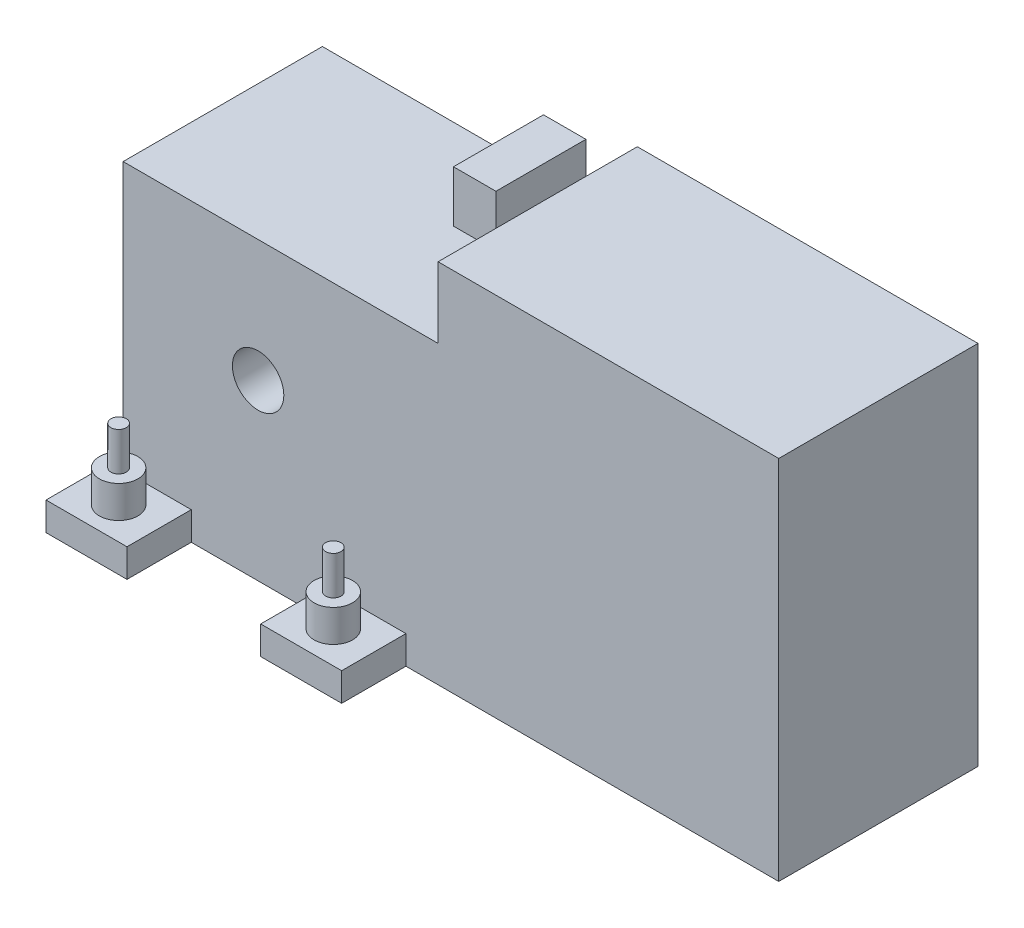
ISO-10303-21;
HEADER;
FILE_DESCRIPTION(('STEP AP214'),'2;1');
FILE_NAME('part.step','',(''),(''),'','','');
FILE_SCHEMA(('AUTOMOTIVE_DESIGN { 1 0 10303 214 1 1 1 1 }'));
ENDSEC;
DATA;
#1=APPLICATION_CONTEXT('core data for automotive mechanical design processes');
#2=APPLICATION_PROTOCOL_DEFINITION('international standard','automotive_design',2000,#1);
#3=PRODUCT_CONTEXT('',#1,'mechanical');
#4=PRODUCT('Part','Part','',(#3));
#5=PRODUCT_RELATED_PRODUCT_CATEGORY('part','',(#4));
#6=PRODUCT_DEFINITION_FORMATION('','',#4);
#7=PRODUCT_DEFINITION_CONTEXT('part definition',#1,'design');
#8=PRODUCT_DEFINITION('design','',#6,#7);
#9=PRODUCT_DEFINITION_SHAPE('','',#8);
#10=(LENGTH_UNIT() NAMED_UNIT(*) SI_UNIT(.MILLI.,.METRE.));
#11=(NAMED_UNIT(*) PLANE_ANGLE_UNIT() SI_UNIT($,.RADIAN.));
#12=(NAMED_UNIT(*) SI_UNIT($,.STERADIAN.) SOLID_ANGLE_UNIT());
#13=UNCERTAINTY_MEASURE_WITH_UNIT(LENGTH_MEASURE(1.E-05),#10,'distance_accuracy_value','');
#14=(GEOMETRIC_REPRESENTATION_CONTEXT(3) GLOBAL_UNCERTAINTY_ASSIGNED_CONTEXT((#13)) GLOBAL_UNIT_ASSIGNED_CONTEXT((#10,
#11,#12)) REPRESENTATION_CONTEXT('',''));
#15=CARTESIAN_POINT('',(0.,0.,0.));
#16=DIRECTION('',(0.,0.,1.));
#17=DIRECTION('',(1.,0.,0.));
#18=AXIS2_PLACEMENT_3D('',#15,#16,#17);
#19=CARTESIAN_POINT('',(0.,0.,5.));
#20=DIRECTION('',(0.,0.,-1.));
#21=DIRECTION('',(-1.,0.,0.));
#22=AXIS2_PLACEMENT_3D('',#19,#20,#21);
#23=CYLINDRICAL_SURFACE('',#22,20.);
#24=CARTESIAN_POINT('',(0.,0.,-155.));
#25=DIRECTION('',(0.,0.,-1.));
#26=DIRECTION('',(-1.,0.,0.));
#27=AXIS2_PLACEMENT_3D('',#24,#25,#26);
#28=CIRCLE('',#27,20.);
#29=CARTESIAN_POINT('',(-20.,0.,-155.));
#30=VERTEX_POINT('',#29);
#31=EDGE_CURVE('E287',#30,#30,#28,.F.);
#32=ORIENTED_EDGE('',*,*,#31,.F.);
#33=EDGE_LOOP('',(#32));
#34=FACE_BOUND('',#33,.T.);
#35=CARTESIAN_POINT('',(0.,0.,0.));
#36=DIRECTION('',(0.,0.,1.));
#37=DIRECTION('',(1.,0.,0.));
#38=AXIS2_PLACEMENT_3D('',#35,#36,#37);
#39=CIRCLE('',#38,20.);
#40=CARTESIAN_POINT('',(20.,0.,0.));
#41=VERTEX_POINT('',#40);
#42=EDGE_CURVE('E376',#41,#41,#39,.T.);
#43=ORIENTED_EDGE('',*,*,#42,.T.);
#44=EDGE_LOOP('',(#43));
#45=FACE_BOUND('',#44,.T.);
#46=ADVANCED_FACE('F41',(#34,#45),#23,.F.);
#47=CARTESIAN_POINT('',(0.,0.,0.));
#48=DIRECTION('',(0.,0.,-1.));
#49=DIRECTION('',(-1.,0.,0.));
#50=AXIS2_PLACEMENT_3D('',#47,#48,#49);
#51=PLANE('',#50);
#52=DIRECTION('',(0.,-1.,0.));
#53=VECTOR('',#52,1.);
#54=CARTESIAN_POINT('',(52.,-113.,0.));
#55=LINE('',#54,#53);
#56=CARTESIAN_POINT('',(52.,-113.,0.));
#57=VERTEX_POINT('',#56);
#58=CARTESIAN_POINT('',(52.,-135.,0.));
#59=VERTEX_POINT('',#58);
#60=EDGE_CURVE('E55',#57,#59,#55,.T.);
#61=ORIENTED_EDGE('',*,*,#60,.F.);
#62=DIRECTION('',(-1.,0.,0.));
#63=VECTOR('',#62,1.);
#64=CARTESIAN_POINT('',(0.,-113.,0.));
#65=LINE('',#64,#63);
#66=CARTESIAN_POINT('',(115.,-113.,0.));
#67=VERTEX_POINT('',#66);
#68=EDGE_CURVE('E60',#67,#57,#65,.T.);
#69=ORIENTED_EDGE('',*,*,#68,.F.);
#70=DIRECTION('',(0.,-1.,0.));
#71=VECTOR('',#70,1.);
#72=CARTESIAN_POINT('',(115.,-113.,0.));
#73=LINE('',#72,#71);
#74=CARTESIAN_POINT('',(115.,-135.,0.));
#75=VERTEX_POINT('',#74);
#76=EDGE_CURVE('E178',#67,#75,#73,.T.);
#77=ORIENTED_EDGE('',*,*,#76,.T.);
#78=DIRECTION('',(1.,0.,0.));
#79=VECTOR('',#78,1.);
#80=CARTESIAN_POINT('',(0.,-135.,0.));
#81=LINE('',#80,#79);
#82=CARTESIAN_POINT('',(405.,-135.,0.));
#83=VERTEX_POINT('',#82);
#84=EDGE_CURVE('E260',#75,#83,#81,.T.);
#85=ORIENTED_EDGE('',*,*,#84,.T.);
#86=DIRECTION('',(0.,-1.,0.));
#87=VECTOR('',#86,1.);
#88=CARTESIAN_POINT('',(405.,-1.57768535078312E-13,0.));
#89=LINE('',#88,#87);
#90=CARTESIAN_POINT('',(405.,150.,0.));
#91=VERTEX_POINT('',#90);
#92=EDGE_CURVE('E272',#91,#83,#89,.T.);
#93=ORIENTED_EDGE('',*,*,#92,.F.);
#94=DIRECTION('',(-1.,0.,0.));
#95=VECTOR('',#94,1.);
#96=CARTESIAN_POINT('',(0.,150.,0.));
#97=LINE('',#96,#95);
#98=CARTESIAN_POINT('',(140.,150.,0.));
#99=VERTEX_POINT('',#98);
#100=EDGE_CURVE('E303',#91,#99,#97,.T.);
#101=ORIENTED_EDGE('',*,*,#100,.T.);
#102=DIRECTION('',(0.,-1.,0.));
#103=VECTOR('',#102,1.);
#104=CARTESIAN_POINT('',(140.,0.,0.));
#105=LINE('',#104,#103);
#106=CARTESIAN_POINT('',(140.,95.,0.));
#107=VERTEX_POINT('',#106);
#108=EDGE_CURVE('E300',#99,#107,#105,.T.);
#109=ORIENTED_EDGE('',*,*,#108,.T.);
#110=DIRECTION('',(1.,0.,0.));
#111=VECTOR('',#110,1.);
#112=CARTESIAN_POINT('',(0.,95.,0.));
#113=LINE('',#112,#111);
#114=CARTESIAN_POINT('',(-105.,95.,0.));
#115=VERTEX_POINT('',#114);
#116=EDGE_CURVE('E297',#115,#107,#113,.T.);
#117=ORIENTED_EDGE('',*,*,#116,.F.);
#118=DIRECTION('',(0.,-1.,0.));
#119=VECTOR('',#118,1.);
#120=CARTESIAN_POINT('',(-105.,0.,0.));
#121=LINE('',#120,#119);
#122=CARTESIAN_POINT('',(-105.,-113.,0.));
#123=VERTEX_POINT('',#122);
#124=EDGE_CURVE('E294',#115,#123,#121,.T.);
#125=ORIENTED_EDGE('',*,*,#124,.T.);
#126=DIRECTION('',(-1.,0.,0.));
#127=VECTOR('',#126,1.);
#128=CARTESIAN_POINT('',(0.,-113.,0.));
#129=LINE('',#128,#127);
#130=CARTESIAN_POINT('',(-52.,-113.,0.));
#131=VERTEX_POINT('',#130);
#132=EDGE_CURVE('E208',#131,#123,#129,.T.);
#133=ORIENTED_EDGE('',*,*,#132,.F.);
#134=DIRECTION('',(0.,-1.,0.));
#135=VECTOR('',#134,1.);
#136=CARTESIAN_POINT('',(-52.,-113.,0.));
#137=LINE('',#136,#135);
#138=CARTESIAN_POINT('',(-52.,-135.,0.));
#139=VERTEX_POINT('',#138);
#140=EDGE_CURVE('E219',#131,#139,#137,.T.);
#141=ORIENTED_EDGE('',*,*,#140,.T.);
#142=EDGE_CURVE('E291',#139,#59,#81,.T.);
#143=ORIENTED_EDGE('',*,*,#142,.T.);
#144=EDGE_LOOP('',(#61,#69,#77,#85,#93,#101,#109,#117,#125,#133,#141,#143));
#145=FACE_BOUND('',#144,.T.);
#146=ORIENTED_EDGE('',*,*,#42,.F.);
#147=EDGE_LOOP('',(#146));
#148=FACE_BOUND('',#147,.T.);
#149=ADVANCED_FACE('F324',(#145,#148),#51,.F.);
#150=CARTESIAN_POINT('',(0.,95.,-155.));
#151=DIRECTION('',(0.,-1.,0.));
#152=DIRECTION('',(1.,0.,0.));
#153=AXIS2_PLACEMENT_3D('',#150,#151,#152);
#154=PLANE('',#153);
#155=DIRECTION('',(0.,0.,-1.));
#156=VECTOR('',#155,1.);
#157=CARTESIAN_POINT('',(100.,95.,-85.));
#158=LINE('',#157,#156);
#159=CARTESIAN_POINT('',(100.,95.,-85.));
#160=VERTEX_POINT('',#159);
#161=CARTESIAN_POINT('',(100.,95.,-155.));
#162=VERTEX_POINT('',#161);
#163=EDGE_CURVE('E258',#160,#162,#158,.T.);
#164=ORIENTED_EDGE('',*,*,#163,.F.);
#165=DIRECTION('',(1.,0.,0.));
#166=VECTOR('',#165,1.);
#167=CARTESIAN_POINT('',(0.,95.,-85.));
#168=LINE('',#167,#166);
#169=CARTESIAN_POINT('',(67.0000000000001,95.,-85.));
#170=VERTEX_POINT('',#169);
#171=EDGE_CURVE('E240',#170,#160,#168,.T.);
#172=ORIENTED_EDGE('',*,*,#171,.F.);
#173=DIRECTION('',(0.,0.,-1.));
#174=VECTOR('',#173,1.);
#175=CARTESIAN_POINT('',(67.0000000000001,95.,-85.));
#176=LINE('',#175,#174);
#177=CARTESIAN_POINT('',(67.0000000000001,95.,-155.));
#178=VERTEX_POINT('',#177);
#179=EDGE_CURVE('E251',#170,#178,#176,.T.);
#180=ORIENTED_EDGE('',*,*,#179,.T.);
#181=DIRECTION('',(1.,0.,0.));
#182=VECTOR('',#181,1.);
#183=CARTESIAN_POINT('',(0.,95.,-155.));
#184=LINE('',#183,#182);
#185=CARTESIAN_POINT('',(-105.,95.,-155.));
#186=VERTEX_POINT('',#185);
#187=EDGE_CURVE('E276',#186,#178,#184,.T.);
#188=ORIENTED_EDGE('',*,*,#187,.F.);
#189=DIRECTION('',(0.,0.,1.));
#190=VECTOR('',#189,1.);
#191=CARTESIAN_POINT('',(-105.,95.,-155.));
#192=LINE('',#191,#190);
#193=EDGE_CURVE('E48',#186,#115,#192,.T.);
#194=ORIENTED_EDGE('',*,*,#193,.T.);
#195=ORIENTED_EDGE('',*,*,#116,.T.);
#196=DIRECTION('',(0.,0.,1.));
#197=VECTOR('',#196,1.);
#198=CARTESIAN_POINT('',(140.,95.,-155.));
#199=LINE('',#198,#197);
#200=CARTESIAN_POINT('',(140.,95.,-155.));
#201=VERTEX_POINT('',#200);
#202=EDGE_CURVE('E314',#201,#107,#199,.T.);
#203=ORIENTED_EDGE('',*,*,#202,.F.);
#204=EDGE_CURVE('E275',#162,#201,#184,.T.);
#205=ORIENTED_EDGE('',*,*,#204,.F.);
#206=EDGE_LOOP('',(#164,#172,#180,#188,#194,#195,#203,#205));
#207=FACE_BOUND('',#206,.T.);
#208=ADVANCED_FACE('F319',(#207),#154,.F.);
#209=CARTESIAN_POINT('',(0.,-135.,-155.));
#210=DIRECTION('',(0.,-1.,0.));
#211=DIRECTION('',(0.,0.,-1.));
#212=AXIS2_PLACEMENT_3D('',#209,#210,#211);
#213=PLANE('',#212);
#214=ORIENTED_EDGE('',*,*,#142,.F.);
#215=DIRECTION('',(0.,0.,1.));
#216=VECTOR('',#215,1.);
#217=CARTESIAN_POINT('',(-52.,-135.,0.));
#218=LINE('',#217,#216);
#219=CARTESIAN_POINT('',(-52.,-135.,50.));
#220=VERTEX_POINT('',#219);
#221=EDGE_CURVE('E221',#139,#220,#218,.T.);
#222=ORIENTED_EDGE('',*,*,#221,.T.);
#223=DIRECTION('',(1.,0.,0.));
#224=VECTOR('',#223,1.);
#225=CARTESIAN_POINT('',(0.,-135.,50.));
#226=LINE('',#225,#224);
#227=CARTESIAN_POINT('',(-115.,-135.,50.));
#228=VERTEX_POINT('',#227);
#229=EDGE_CURVE('E224',#228,#220,#226,.T.);
#230=ORIENTED_EDGE('',*,*,#229,.F.);
#231=DIRECTION('',(0.,0.,1.));
#232=VECTOR('',#231,1.);
#233=CARTESIAN_POINT('',(-115.,-135.,0.));
#234=LINE('',#233,#232);
#235=CARTESIAN_POINT('',(-115.,-135.,0.));
#236=VERTEX_POINT('',#235);
#237=EDGE_CURVE('E227',#236,#228,#234,.T.);
#238=ORIENTED_EDGE('',*,*,#237,.F.);
#239=DIRECTION('',(-1.,0.,0.));
#240=VECTOR('',#239,1.);
#241=CARTESIAN_POINT('',(0.,-135.,0.));
#242=LINE('',#241,#240);
#243=CARTESIAN_POINT('',(-105.,-135.,0.));
#244=VERTEX_POINT('',#243);
#245=EDGE_CURVE('E205',#244,#236,#242,.T.);
#246=ORIENTED_EDGE('',*,*,#245,.F.);
#247=DIRECTION('',(0.,0.,1.));
#248=VECTOR('',#247,1.);
#249=CARTESIAN_POINT('',(-105.,-135.,-155.));
#250=LINE('',#249,#248);
#251=CARTESIAN_POINT('',(-105.,-135.,-155.));
#252=VERTEX_POINT('',#251);
#253=EDGE_CURVE('E11',#252,#244,#250,.T.);
#254=ORIENTED_EDGE('',*,*,#253,.F.);
#255=DIRECTION('',(1.,0.,0.));
#256=VECTOR('',#255,1.);
#257=CARTESIAN_POINT('',(0.,-135.,-155.));
#258=LINE('',#257,#256);
#259=CARTESIAN_POINT('',(405.,-135.,-155.));
#260=VERTEX_POINT('',#259);
#261=EDGE_CURVE('E268',#252,#260,#258,.T.);
#262=ORIENTED_EDGE('',*,*,#261,.T.);
#263=DIRECTION('',(0.,0.,1.));
#264=VECTOR('',#263,1.);
#265=CARTESIAN_POINT('',(405.,-135.,-155.));
#266=LINE('',#265,#264);
#267=EDGE_CURVE('E290',#260,#83,#266,.T.);
#268=ORIENTED_EDGE('',*,*,#267,.T.);
#269=ORIENTED_EDGE('',*,*,#84,.F.);
#270=DIRECTION('',(0.,0.,1.));
#271=VECTOR('',#270,1.);
#272=CARTESIAN_POINT('',(115.,-135.,0.));
#273=LINE('',#272,#271);
#274=CARTESIAN_POINT('',(115.,-135.,50.));
#275=VERTEX_POINT('',#274);
#276=EDGE_CURVE('E198',#75,#275,#273,.T.);
#277=ORIENTED_EDGE('',*,*,#276,.T.);
#278=DIRECTION('',(-1.,0.,0.));
#279=VECTOR('',#278,1.);
#280=CARTESIAN_POINT('',(0.,-135.,50.));
#281=LINE('',#280,#279);
#282=CARTESIAN_POINT('',(52.,-135.,50.));
#283=VERTEX_POINT('',#282);
#284=EDGE_CURVE('E172',#275,#283,#281,.T.);
#285=ORIENTED_EDGE('',*,*,#284,.T.);
#286=DIRECTION('',(0.,0.,1.));
#287=VECTOR('',#286,1.);
#288=CARTESIAN_POINT('',(52.,-135.,0.));
#289=LINE('',#288,#287);
#290=EDGE_CURVE('E190',#59,#283,#289,.T.);
#291=ORIENTED_EDGE('',*,*,#290,.F.);
#292=EDGE_LOOP('',(#214,#222,#230,#238,#246,#254,#262,#268,#269,#277,#285,#291));
#293=FACE_BOUND('',#292,.T.);
#294=ADVANCED_FACE('F336',(#293),#213,.T.);
#295=CARTESIAN_POINT('',(-105.,0.,-155.));
#296=DIRECTION('',(-1.,0.,0.));
#297=DIRECTION('',(0.,-1.,0.));
#298=AXIS2_PLACEMENT_3D('',#295,#296,#297);
#299=PLANE('',#298);
#300=ORIENTED_EDGE('',*,*,#124,.F.);
#301=ORIENTED_EDGE('',*,*,#193,.F.);
#302=DIRECTION('',(0.,-1.,0.));
#303=VECTOR('',#302,1.);
#304=CARTESIAN_POINT('',(-105.,0.,-155.));
#305=LINE('',#304,#303);
#306=EDGE_CURVE('E271',#186,#252,#305,.T.);
#307=ORIENTED_EDGE('',*,*,#306,.T.);
#308=ORIENTED_EDGE('',*,*,#253,.T.);
#309=EDGE_CURVE('E293',#123,#244,#121,.T.);
#310=ORIENTED_EDGE('',*,*,#309,.F.);
#311=EDGE_LOOP('',(#300,#301,#307,#308,#310));
#312=FACE_BOUND('',#311,.T.);
#313=ADVANCED_FACE('F328',(#312),#299,.T.);
#314=CARTESIAN_POINT('',(140.,0.,-155.));
#315=DIRECTION('',(-1.,0.,0.));
#316=DIRECTION('',(0.,-1.,0.));
#317=AXIS2_PLACEMENT_3D('',#314,#315,#316);
#318=PLANE('',#317);
#319=ORIENTED_EDGE('',*,*,#108,.F.);
#320=DIRECTION('',(0.,0.,1.));
#321=VECTOR('',#320,1.);
#322=CARTESIAN_POINT('',(140.,150.,-155.));
#323=LINE('',#322,#321);
#324=CARTESIAN_POINT('',(140.,150.,-155.));
#325=VERTEX_POINT('',#324);
#326=EDGE_CURVE('E312',#325,#99,#323,.T.);
#327=ORIENTED_EDGE('',*,*,#326,.F.);
#328=DIRECTION('',(0.,-1.,0.));
#329=VECTOR('',#328,1.);
#330=CARTESIAN_POINT('',(140.,0.,-155.));
#331=LINE('',#330,#329);
#332=EDGE_CURVE('E279',#325,#201,#331,.T.);
#333=ORIENTED_EDGE('',*,*,#332,.T.);
#334=ORIENTED_EDGE('',*,*,#202,.T.);
#335=EDGE_LOOP('',(#319,#327,#333,#334));
#336=FACE_BOUND('',#335,.T.);
#337=ADVANCED_FACE('F595',(#336),#318,.T.);
#338=CARTESIAN_POINT('',(0.,150.,-155.));
#339=DIRECTION('',(0.,1.,0.));
#340=DIRECTION('',(0.,0.,1.));
#341=AXIS2_PLACEMENT_3D('',#338,#339,#340);
#342=PLANE('',#341);
#343=ORIENTED_EDGE('',*,*,#100,.F.);
#344=DIRECTION('',(0.,0.,1.));
#345=VECTOR('',#344,1.);
#346=CARTESIAN_POINT('',(405.,150.,-155.));
#347=LINE('',#346,#345);
#348=CARTESIAN_POINT('',(405.,150.,-155.));
#349=VERTEX_POINT('',#348);
#350=EDGE_CURVE('E310',#349,#91,#347,.T.);
#351=ORIENTED_EDGE('',*,*,#350,.F.);
#352=DIRECTION('',(-1.,0.,0.));
#353=VECTOR('',#352,1.);
#354=CARTESIAN_POINT('',(0.,150.,-155.));
#355=LINE('',#354,#353);
#356=EDGE_CURVE('E282',#349,#325,#355,.T.);
#357=ORIENTED_EDGE('',*,*,#356,.T.);
#358=ORIENTED_EDGE('',*,*,#326,.T.);
#359=EDGE_LOOP('',(#343,#351,#357,#358));
#360=FACE_BOUND('',#359,.T.);
#361=ADVANCED_FACE('F605',(#360),#342,.T.);
#362=CARTESIAN_POINT('',(405.,-1.57768535078312E-13,-155.));
#363=DIRECTION('',(-1.,0.,0.));
#364=DIRECTION('',(0.,-1.,0.));
#365=AXIS2_PLACEMENT_3D('',#362,#363,#364);
#366=PLANE('',#365);
#367=ORIENTED_EDGE('',*,*,#92,.T.);
#368=ORIENTED_EDGE('',*,*,#267,.F.);
#369=DIRECTION('',(0.,-1.,0.));
#370=VECTOR('',#369,1.);
#371=CARTESIAN_POINT('',(405.,-1.57768535078312E-13,-155.));
#372=LINE('',#371,#370);
#373=EDGE_CURVE('E285',#349,#260,#372,.T.);
#374=ORIENTED_EDGE('',*,*,#373,.F.);
#375=ORIENTED_EDGE('',*,*,#350,.T.);
#376=EDGE_LOOP('',(#367,#368,#374,#375));
#377=FACE_BOUND('',#376,.T.);
#378=ADVANCED_FACE('F618',(#377),#366,.F.);
#379=CARTESIAN_POINT('',(0.,0.,-155.));
#380=DIRECTION('',(0.,0.,-1.));
#381=DIRECTION('',(-1.,0.,0.));
#382=AXIS2_PLACEMENT_3D('',#379,#380,#381);
#383=PLANE('',#382);
#384=ORIENTED_EDGE('',*,*,#261,.F.);
#385=ORIENTED_EDGE('',*,*,#306,.F.);
#386=ORIENTED_EDGE('',*,*,#187,.T.);
#387=DIRECTION('',(0.,1.,0.));
#388=VECTOR('',#387,1.);
#389=CARTESIAN_POINT('',(67.0000000000001,0.,-155.));
#390=LINE('',#389,#388);
#391=CARTESIAN_POINT('',(67.0000000000001,135.,-155.));
#392=VERTEX_POINT('',#391);
#393=EDGE_CURVE('E232',#178,#392,#390,.T.);
#394=ORIENTED_EDGE('',*,*,#393,.T.);
#395=DIRECTION('',(-1.,0.,0.));
#396=VECTOR('',#395,1.);
#397=CARTESIAN_POINT('',(0.,135.,-155.));
#398=LINE('',#397,#396);
#399=CARTESIAN_POINT('',(100.,135.,-155.));
#400=VERTEX_POINT('',#399);
#401=EDGE_CURVE('E254',#400,#392,#398,.T.);
#402=ORIENTED_EDGE('',*,*,#401,.F.);
#403=DIRECTION('',(0.,1.,0.));
#404=VECTOR('',#403,1.);
#405=CARTESIAN_POINT('',(100.,0.,-155.));
#406=LINE('',#405,#404);
#407=EDGE_CURVE('E244',#162,#400,#406,.T.);
#408=ORIENTED_EDGE('',*,*,#407,.F.);
#409=ORIENTED_EDGE('',*,*,#204,.T.);
#410=ORIENTED_EDGE('',*,*,#332,.F.);
#411=ORIENTED_EDGE('',*,*,#356,.F.);
#412=ORIENTED_EDGE('',*,*,#373,.T.);
#413=EDGE_LOOP('',(#384,#385,#386,#394,#402,#408,#409,#410,#411,#412));
#414=FACE_BOUND('',#413,.T.);
#415=ORIENTED_EDGE('',*,*,#31,.T.);
#416=EDGE_LOOP('',(#415));
#417=FACE_BOUND('',#416,.T.);
#418=ADVANCED_FACE('F628',(#414,#417),#383,.T.);
#419=CARTESIAN_POINT('',(100.,0.,-85.));
#420=DIRECTION('',(-1.,0.,0.));
#421=DIRECTION('',(0.,-1.,0.));
#422=AXIS2_PLACEMENT_3D('',#419,#420,#421);
#423=PLANE('',#422);
#424=ORIENTED_EDGE('',*,*,#407,.T.);
#425=DIRECTION('',(0.,0.,-1.));
#426=VECTOR('',#425,1.);
#427=CARTESIAN_POINT('',(100.,135.,-85.));
#428=LINE('',#427,#426);
#429=CARTESIAN_POINT('',(100.,135.,-85.));
#430=VERTEX_POINT('',#429);
#431=EDGE_CURVE('E261',#430,#400,#428,.T.);
#432=ORIENTED_EDGE('',*,*,#431,.F.);
#433=DIRECTION('',(0.,1.,0.));
#434=VECTOR('',#433,1.);
#435=CARTESIAN_POINT('',(100.,0.,-85.));
#436=LINE('',#435,#434);
#437=EDGE_CURVE('E249',#160,#430,#436,.T.);
#438=ORIENTED_EDGE('',*,*,#437,.F.);
#439=ORIENTED_EDGE('',*,*,#163,.T.);
#440=EDGE_LOOP('',(#424,#432,#438,#439));
#441=FACE_BOUND('',#440,.T.);
#442=ADVANCED_FACE('F639',(#441),#423,.F.);
#443=CARTESIAN_POINT('',(0.,135.,-85.));
#444=DIRECTION('',(0.,-1.,0.));
#445=DIRECTION('',(0.,0.,-1.));
#446=AXIS2_PLACEMENT_3D('',#443,#444,#445);
#447=PLANE('',#446);
#448=ORIENTED_EDGE('',*,*,#401,.T.);
#449=DIRECTION('',(0.,0.,-1.));
#450=VECTOR('',#449,1.);
#451=CARTESIAN_POINT('',(67.0000000000001,135.,-85.));
#452=LINE('',#451,#450);
#453=CARTESIAN_POINT('',(67.0000000000001,135.,-85.));
#454=VERTEX_POINT('',#453);
#455=EDGE_CURVE('E264',#454,#392,#452,.T.);
#456=ORIENTED_EDGE('',*,*,#455,.F.);
#457=DIRECTION('',(-1.,0.,0.));
#458=VECTOR('',#457,1.);
#459=CARTESIAN_POINT('',(0.,135.,-85.));
#460=LINE('',#459,#458);
#461=EDGE_CURVE('E247',#430,#454,#460,.T.);
#462=ORIENTED_EDGE('',*,*,#461,.F.);
#463=ORIENTED_EDGE('',*,*,#431,.T.);
#464=EDGE_LOOP('',(#448,#456,#462,#463));
#465=FACE_BOUND('',#464,.T.);
#466=ADVANCED_FACE('F663',(#465),#447,.F.);
#467=CARTESIAN_POINT('',(67.0000000000001,0.,-85.));
#468=DIRECTION('',(-1.,0.,0.));
#469=DIRECTION('',(0.,0.,1.));
#470=AXIS2_PLACEMENT_3D('',#467,#468,#469);
#471=PLANE('',#470);
#472=ORIENTED_EDGE('',*,*,#393,.F.);
#473=ORIENTED_EDGE('',*,*,#179,.F.);
#474=DIRECTION('',(0.,1.,0.));
#475=VECTOR('',#474,1.);
#476=CARTESIAN_POINT('',(67.0000000000001,0.,-85.));
#477=LINE('',#476,#475);
#478=EDGE_CURVE('E243',#170,#454,#477,.T.);
#479=ORIENTED_EDGE('',*,*,#478,.T.);
#480=ORIENTED_EDGE('',*,*,#455,.T.);
#481=EDGE_LOOP('',(#472,#473,#479,#480));
#482=FACE_BOUND('',#481,.T.);
#483=ADVANCED_FACE('F671',(#482),#471,.T.);
#484=CARTESIAN_POINT('',(0.,0.,-85.));
#485=DIRECTION('',(0.,0.,-1.));
#486=DIRECTION('',(-1.,0.,0.));
#487=AXIS2_PLACEMENT_3D('',#484,#485,#486);
#488=PLANE('',#487);
#489=ORIENTED_EDGE('',*,*,#171,.T.);
#490=ORIENTED_EDGE('',*,*,#437,.T.);
#491=ORIENTED_EDGE('',*,*,#461,.T.);
#492=ORIENTED_EDGE('',*,*,#478,.F.);
#493=EDGE_LOOP('',(#489,#490,#491,#492));
#494=FACE_BOUND('',#493,.T.);
#495=ADVANCED_FACE('F470',(#494),#488,.F.);
#496=CARTESIAN_POINT('',(0.,-113.,0.));
#497=DIRECTION('',(0.,0.,1.));
#498=DIRECTION('',(1.,0.,0.));
#499=AXIS2_PLACEMENT_3D('',#496,#497,#498);
#500=PLANE('',#499);
#501=ORIENTED_EDGE('',*,*,#309,.T.);
#502=ORIENTED_EDGE('',*,*,#245,.T.);
#503=DIRECTION('',(0.,-1.,0.));
#504=VECTOR('',#503,1.);
#505=CARTESIAN_POINT('',(-115.,-113.,0.));
#506=LINE('',#505,#504);
#507=CARTESIAN_POINT('',(-115.,-113.,0.));
#508=VERTEX_POINT('',#507);
#509=EDGE_CURVE('E229',#508,#236,#506,.T.);
#510=ORIENTED_EDGE('',*,*,#509,.F.);
#511=EDGE_CURVE('E212',#123,#508,#129,.T.);
#512=ORIENTED_EDGE('',*,*,#511,.F.);
#513=EDGE_LOOP('',(#501,#502,#510,#512));
#514=FACE_BOUND('',#513,.T.);
#515=ADVANCED_FACE('F332',(#514),#500,.F.);
#516=CARTESIAN_POINT('',(-115.,-113.,0.));
#517=DIRECTION('',(1.,0.,0.));
#518=DIRECTION('',(0.,0.,-1.));
#519=AXIS2_PLACEMENT_3D('',#516,#517,#518);
#520=PLANE('',#519);
#521=ORIENTED_EDGE('',*,*,#237,.T.);
#522=DIRECTION('',(0.,-1.,0.));
#523=VECTOR('',#522,1.);
#524=CARTESIAN_POINT('',(-115.,-113.,50.));
#525=LINE('',#524,#523);
#526=CARTESIAN_POINT('',(-115.,-113.,50.));
#527=VERTEX_POINT('',#526);
#528=EDGE_CURVE('E233',#527,#228,#525,.T.);
#529=ORIENTED_EDGE('',*,*,#528,.F.);
#530=DIRECTION('',(0.,0.,1.));
#531=VECTOR('',#530,1.);
#532=CARTESIAN_POINT('',(-115.,-113.,0.));
#533=LINE('',#532,#531);
#534=EDGE_CURVE('E217',#508,#527,#533,.T.);
#535=ORIENTED_EDGE('',*,*,#534,.F.);
#536=ORIENTED_EDGE('',*,*,#509,.T.);
#537=EDGE_LOOP('',(#521,#529,#535,#536));
#538=FACE_BOUND('',#537,.T.);
#539=ADVANCED_FACE('F342',(#538),#520,.F.);
#540=CARTESIAN_POINT('',(0.,-113.,50.));
#541=DIRECTION('',(0.,0.,-1.));
#542=DIRECTION('',(-1.,0.,0.));
#543=AXIS2_PLACEMENT_3D('',#540,#541,#542);
#544=PLANE('',#543);
#545=ORIENTED_EDGE('',*,*,#229,.T.);
#546=DIRECTION('',(0.,-1.,0.));
#547=VECTOR('',#546,1.);
#548=CARTESIAN_POINT('',(-52.,-113.,50.));
#549=LINE('',#548,#547);
#550=CARTESIAN_POINT('',(-52.,-113.,50.));
#551=VERTEX_POINT('',#550);
#552=EDGE_CURVE('E236',#551,#220,#549,.T.);
#553=ORIENTED_EDGE('',*,*,#552,.F.);
#554=DIRECTION('',(1.,0.,0.));
#555=VECTOR('',#554,1.);
#556=CARTESIAN_POINT('',(0.,-113.,50.));
#557=LINE('',#556,#555);
#558=EDGE_CURVE('E215',#527,#551,#557,.T.);
#559=ORIENTED_EDGE('',*,*,#558,.F.);
#560=ORIENTED_EDGE('',*,*,#528,.T.);
#561=EDGE_LOOP('',(#545,#553,#559,#560));
#562=FACE_BOUND('',#561,.T.);
#563=ADVANCED_FACE('F487',(#562),#544,.F.);
#564=CARTESIAN_POINT('',(-52.,-113.,0.));
#565=DIRECTION('',(1.,0.,0.));
#566=DIRECTION('',(0.,0.,-1.));
#567=AXIS2_PLACEMENT_3D('',#564,#565,#566);
#568=PLANE('',#567);
#569=ORIENTED_EDGE('',*,*,#221,.F.);
#570=ORIENTED_EDGE('',*,*,#140,.F.);
#571=DIRECTION('',(0.,0.,1.));
#572=VECTOR('',#571,1.);
#573=CARTESIAN_POINT('',(-52.,-113.,0.));
#574=LINE('',#573,#572);
#575=EDGE_CURVE('E211',#131,#551,#574,.T.);
#576=ORIENTED_EDGE('',*,*,#575,.T.);
#577=ORIENTED_EDGE('',*,*,#552,.T.);
#578=EDGE_LOOP('',(#569,#570,#576,#577));
#579=FACE_BOUND('',#578,.T.);
#580=ADVANCED_FACE('F351',(#579),#568,.T.);
#581=CARTESIAN_POINT('',(0.,-113.,0.));
#582=DIRECTION('',(0.,-1.,0.));
#583=DIRECTION('',(0.,0.,-1.));
#584=AXIS2_PLACEMENT_3D('',#581,#582,#583);
#585=PLANE('',#584);
#586=CARTESIAN_POINT('',(-83.5,-113.,25.));
#587=DIRECTION('',(0.,-1.,0.));
#588=DIRECTION('',(0.,0.,-1.));
#589=AXIS2_PLACEMENT_3D('',#586,#587,#588);
#590=CIRCLE('',#589,15.);
#591=CARTESIAN_POINT('',(-83.5,-113.,10.));
#592=VERTEX_POINT('',#591);
#593=EDGE_CURVE('E200',#592,#592,#590,.T.);
#594=ORIENTED_EDGE('',*,*,#593,.T.);
#595=EDGE_LOOP('',(#594));
#596=FACE_BOUND('',#595,.T.);
#597=ORIENTED_EDGE('',*,*,#132,.T.);
#598=ORIENTED_EDGE('',*,*,#511,.T.);
#599=ORIENTED_EDGE('',*,*,#534,.T.);
#600=ORIENTED_EDGE('',*,*,#558,.T.);
#601=ORIENTED_EDGE('',*,*,#575,.F.);
#602=EDGE_LOOP('',(#597,#598,#599,#600,#601));
#603=FACE_BOUND('',#602,.T.);
#604=ADVANCED_FACE('F345',(#596,#603),#585,.F.);
#605=CARTESIAN_POINT('',(52.,-113.,0.));
#606=DIRECTION('',(1.,0.,0.));
#607=DIRECTION('',(0.,0.,-1.));
#608=AXIS2_PLACEMENT_3D('',#605,#606,#607);
#609=PLANE('',#608);
#610=ORIENTED_EDGE('',*,*,#290,.T.);
#611=DIRECTION('',(0.,-1.,0.));
#612=VECTOR('',#611,1.);
#613=CARTESIAN_POINT('',(52.,-113.,50.));
#614=LINE('',#613,#612);
#615=CARTESIAN_POINT('',(52.,-113.,50.));
#616=VERTEX_POINT('',#615);
#617=EDGE_CURVE('E177',#616,#283,#614,.T.);
#618=ORIENTED_EDGE('',*,*,#617,.F.);
#619=DIRECTION('',(0.,0.,1.));
#620=VECTOR('',#619,1.);
#621=CARTESIAN_POINT('',(52.,-113.,0.));
#622=LINE('',#621,#620);
#623=EDGE_CURVE('E185',#57,#616,#622,.T.);
#624=ORIENTED_EDGE('',*,*,#623,.F.);
#625=ORIENTED_EDGE('',*,*,#60,.T.);
#626=EDGE_LOOP('',(#610,#618,#624,#625));
#627=FACE_BOUND('',#626,.T.);
#628=ADVANCED_FACE('F354',(#627),#609,.F.);
#629=CARTESIAN_POINT('',(0.,-113.,50.));
#630=DIRECTION('',(0.,0.,1.));
#631=DIRECTION('',(1.,0.,0.));
#632=AXIS2_PLACEMENT_3D('',#629,#630,#631);
#633=PLANE('',#632);
#634=ORIENTED_EDGE('',*,*,#284,.F.);
#635=DIRECTION('',(0.,-1.,0.));
#636=VECTOR('',#635,1.);
#637=CARTESIAN_POINT('',(115.,-113.,50.));
#638=LINE('',#637,#636);
#639=CARTESIAN_POINT('',(115.,-113.,50.));
#640=VERTEX_POINT('',#639);
#641=EDGE_CURVE('E167',#640,#275,#638,.T.);
#642=ORIENTED_EDGE('',*,*,#641,.F.);
#643=DIRECTION('',(-1.,0.,0.));
#644=VECTOR('',#643,1.);
#645=CARTESIAN_POINT('',(0.,-113.,50.));
#646=LINE('',#645,#644);
#647=EDGE_CURVE('E170',#640,#616,#646,.T.);
#648=ORIENTED_EDGE('',*,*,#647,.T.);
#649=ORIENTED_EDGE('',*,*,#617,.T.);
#650=EDGE_LOOP('',(#634,#642,#648,#649));
#651=FACE_BOUND('',#650,.T.);
#652=ADVANCED_FACE('F169',(#651),#633,.T.);
#653=CARTESIAN_POINT('',(115.,-113.,0.));
#654=DIRECTION('',(1.,0.,0.));
#655=DIRECTION('',(0.,0.,-1.));
#656=AXIS2_PLACEMENT_3D('',#653,#654,#655);
#657=PLANE('',#656);
#658=ORIENTED_EDGE('',*,*,#276,.F.);
#659=ORIENTED_EDGE('',*,*,#76,.F.);
#660=DIRECTION('',(0.,0.,1.));
#661=VECTOR('',#660,1.);
#662=CARTESIAN_POINT('',(115.,-113.,0.));
#663=LINE('',#662,#661);
#664=EDGE_CURVE('E184',#67,#640,#663,.T.);
#665=ORIENTED_EDGE('',*,*,#664,.T.);
#666=ORIENTED_EDGE('',*,*,#641,.T.);
#667=EDGE_LOOP('',(#658,#659,#665,#666));
#668=FACE_BOUND('',#667,.T.);
#669=ADVANCED_FACE('F188',(#668),#657,.T.);
#670=CARTESIAN_POINT('',(0.,-113.,0.));
#671=DIRECTION('',(0.,-1.,0.));
#672=DIRECTION('',(0.,0.,-1.));
#673=AXIS2_PLACEMENT_3D('',#670,#671,#672);
#674=PLANE('',#673);
#675=ORIENTED_EDGE('',*,*,#68,.T.);
#676=ORIENTED_EDGE('',*,*,#623,.T.);
#677=ORIENTED_EDGE('',*,*,#647,.F.);
#678=ORIENTED_EDGE('',*,*,#664,.F.);
#679=EDGE_LOOP('',(#675,#676,#677,#678));
#680=FACE_BOUND('',#679,.T.);
#681=CARTESIAN_POINT('',(83.5,-113.,25.));
#682=DIRECTION('',(0.,-1.,0.));
#683=DIRECTION('',(0.,0.,-1.));
#684=AXIS2_PLACEMENT_3D('',#681,#682,#683);
#685=CIRCLE('',#684,15.);
#686=CARTESIAN_POINT('',(83.5,-113.,10.));
#687=VERTEX_POINT('',#686);
#688=EDGE_CURVE('E195',#687,#687,#685,.F.);
#689=ORIENTED_EDGE('',*,*,#688,.F.);
#690=EDGE_LOOP('',(#689));
#691=FACE_BOUND('',#690,.T.);
#692=ADVANCED_FACE('F182',(#680,#691),#674,.F.);
#693=CARTESIAN_POINT('',(-83.5,-88.,25.));
#694=DIRECTION('',(0.,-1.,0.));
#695=DIRECTION('',(0.,0.,-1.));
#696=AXIS2_PLACEMENT_3D('',#693,#694,#695);
#697=CYLINDRICAL_SURFACE('',#696,15.);
#698=CARTESIAN_POINT('',(-83.5,-88.,25.));
#699=DIRECTION('',(0.,-1.,0.));
#700=DIRECTION('',(0.,0.,-1.));
#701=AXIS2_PLACEMENT_3D('',#698,#699,#700);
#702=CIRCLE('',#701,15.);
#703=CARTESIAN_POINT('',(-83.5,-88.,10.));
#704=VERTEX_POINT('',#703);
#705=EDGE_CURVE('E394',#704,#704,#702,.T.);
#706=ORIENTED_EDGE('',*,*,#705,.T.);
#707=EDGE_LOOP('',(#706));
#708=FACE_BOUND('',#707,.T.);
#709=ORIENTED_EDGE('',*,*,#593,.F.);
#710=EDGE_LOOP('',(#709));
#711=FACE_BOUND('',#710,.T.);
#712=ADVANCED_FACE('F399',(#708,#711),#697,.T.);
#713=CARTESIAN_POINT('',(0.,-88.,0.));
#714=DIRECTION('',(0.,-1.,0.));
#715=DIRECTION('',(0.,0.,-1.));
#716=AXIS2_PLACEMENT_3D('',#713,#714,#715);
#717=PLANE('',#716);
#718=CARTESIAN_POINT('',(-83.5,-88.,25.));
#719=DIRECTION('',(0.,-1.,0.));
#720=DIRECTION('',(0.,0.,-1.));
#721=AXIS2_PLACEMENT_3D('',#718,#719,#720);
#722=CIRCLE('',#721,6.);
#723=CARTESIAN_POINT('',(-83.5,-88.,19.));
#724=VERTEX_POINT('',#723);
#725=EDGE_CURVE('E385',#724,#724,#722,.T.);
#726=ORIENTED_EDGE('',*,*,#725,.T.);
#727=EDGE_LOOP('',(#726));
#728=FACE_BOUND('',#727,.T.);
#729=ORIENTED_EDGE('',*,*,#705,.F.);
#730=EDGE_LOOP('',(#729));
#731=FACE_BOUND('',#730,.T.);
#732=ADVANCED_FACE('F401',(#728,#731),#717,.F.);
#733=CARTESIAN_POINT('',(83.5,-88.,25.));
#734=DIRECTION('',(0.,-1.,0.));
#735=DIRECTION('',(0.,0.,-1.));
#736=AXIS2_PLACEMENT_3D('',#733,#734,#735);
#737=CYLINDRICAL_SURFACE('',#736,15.);
#738=CARTESIAN_POINT('',(83.5,-88.,25.));
#739=DIRECTION('',(0.,-1.,0.));
#740=DIRECTION('',(0.,0.,-1.));
#741=AXIS2_PLACEMENT_3D('',#738,#739,#740);
#742=CIRCLE('',#741,15.);
#743=CARTESIAN_POINT('',(83.5,-88.,10.));
#744=VERTEX_POINT('',#743);
#745=EDGE_CURVE('E388',#744,#744,#742,.F.);
#746=ORIENTED_EDGE('',*,*,#745,.F.);
#747=EDGE_LOOP('',(#746));
#748=FACE_BOUND('',#747,.T.);
#749=ORIENTED_EDGE('',*,*,#688,.T.);
#750=EDGE_LOOP('',(#749));
#751=FACE_BOUND('',#750,.T.);
#752=ADVANCED_FACE('F408',(#748,#751),#737,.T.);
#753=CARTESIAN_POINT('',(0.,-88.,0.));
#754=DIRECTION('',(0.,-1.,0.));
#755=DIRECTION('',(0.,0.,-1.));
#756=AXIS2_PLACEMENT_3D('',#753,#754,#755);
#757=PLANE('',#756);
#758=ORIENTED_EDGE('',*,*,#745,.T.);
#759=EDGE_LOOP('',(#758));
#760=FACE_BOUND('',#759,.T.);
#761=CARTESIAN_POINT('',(83.5,-88.,25.));
#762=DIRECTION('',(0.,-1.,0.));
#763=DIRECTION('',(0.,0.,-1.));
#764=AXIS2_PLACEMENT_3D('',#761,#762,#763);
#765=CIRCLE('',#764,6.);
#766=CARTESIAN_POINT('',(83.5,-88.,19.));
#767=VERTEX_POINT('',#766);
#768=EDGE_CURVE('E391',#767,#767,#765,.F.);
#769=ORIENTED_EDGE('',*,*,#768,.F.);
#770=EDGE_LOOP('',(#769));
#771=FACE_BOUND('',#770,.T.);
#772=ADVANCED_FACE('F414',(#760,#771),#757,.F.);
#773=CARTESIAN_POINT('',(0.,-58.,0.));
#774=DIRECTION('',(0.,-1.,0.));
#775=DIRECTION('',(0.,0.,-1.));
#776=AXIS2_PLACEMENT_3D('',#773,#774,#775);
#777=PLANE('',#776);
#778=CARTESIAN_POINT('',(-83.5,-58.,25.));
#779=DIRECTION('',(0.,-1.,0.));
#780=DIRECTION('',(0.,0.,-1.));
#781=AXIS2_PLACEMENT_3D('',#778,#779,#780);
#782=CIRCLE('',#781,6.);
#783=CARTESIAN_POINT('',(-83.5,-58.,19.));
#784=VERTEX_POINT('',#783);
#785=EDGE_CURVE('E380',#784,#784,#782,.T.);
#786=ORIENTED_EDGE('',*,*,#785,.F.);
#787=EDGE_LOOP('',(#786));
#788=FACE_BOUND('',#787,.T.);
#789=ADVANCED_FACE('F418',(#788),#777,.F.);
#790=CARTESIAN_POINT('',(-83.5,-58.,25.));
#791=DIRECTION('',(0.,-1.,0.));
#792=DIRECTION('',(0.,0.,-1.));
#793=AXIS2_PLACEMENT_3D('',#790,#791,#792);
#794=CYLINDRICAL_SURFACE('',#793,6.);
#795=ORIENTED_EDGE('',*,*,#785,.T.);
#796=EDGE_LOOP('',(#795));
#797=FACE_BOUND('',#796,.T.);
#798=ORIENTED_EDGE('',*,*,#725,.F.);
#799=EDGE_LOOP('',(#798));
#800=FACE_BOUND('',#799,.T.);
#801=ADVANCED_FACE('F420',(#797,#800),#794,.T.);
#802=CARTESIAN_POINT('',(0.,-58.,0.));
#803=DIRECTION('',(0.,-1.,0.));
#804=DIRECTION('',(0.,0.,-1.));
#805=AXIS2_PLACEMENT_3D('',#802,#803,#804);
#806=PLANE('',#805);
#807=CARTESIAN_POINT('',(83.5,-58.,25.));
#808=DIRECTION('',(0.,-1.,0.));
#809=DIRECTION('',(0.,0.,-1.));
#810=AXIS2_PLACEMENT_3D('',#807,#808,#809);
#811=CIRCLE('',#810,6.);
#812=CARTESIAN_POINT('',(83.5,-58.,19.));
#813=VERTEX_POINT('',#812);
#814=EDGE_CURVE('E377',#813,#813,#811,.F.);
#815=ORIENTED_EDGE('',*,*,#814,.T.);
#816=EDGE_LOOP('',(#815));
#817=FACE_BOUND('',#816,.T.);
#818=ADVANCED_FACE('F423',(#817),#806,.F.);
#819=CARTESIAN_POINT('',(83.5,-58.,25.));
#820=DIRECTION('',(0.,-1.,0.));
#821=DIRECTION('',(0.,0.,-1.));
#822=AXIS2_PLACEMENT_3D('',#819,#820,#821);
#823=CYLINDRICAL_SURFACE('',#822,6.);
#824=ORIENTED_EDGE('',*,*,#814,.F.);
#825=EDGE_LOOP('',(#824));
#826=FACE_BOUND('',#825,.T.);
#827=ORIENTED_EDGE('',*,*,#768,.T.);
#828=EDGE_LOOP('',(#827));
#829=FACE_BOUND('',#828,.T.);
#830=ADVANCED_FACE('F428',(#826,#829),#823,.T.);
#831=CLOSED_SHELL('',(#46,#149,#208,#294,#313,#337,#361,#378,#418,#442,#466,#483,#495,#515,#539,
#563,#580,#604,#628,#652,#669,#692,#712,#732,#752,#772,#789,#801,#818,#830));
#832=MANIFOLD_SOLID_BREP('B2',#831);
#833=ADVANCED_BREP_SHAPE_REPRESENTATION('',(#18,#832),#14);
#834=SHAPE_DEFINITION_REPRESENTATION(#9,#833);
ENDSEC;
END-ISO-10303-21;
